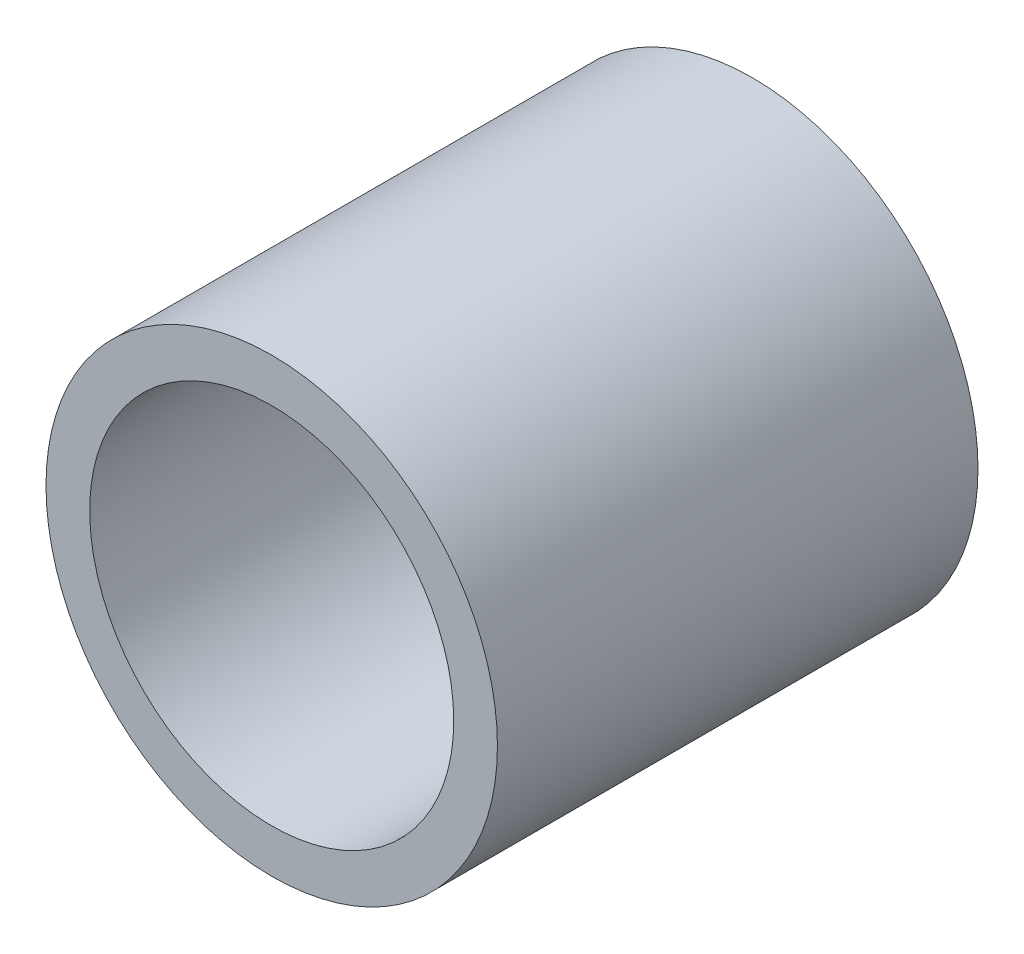
ISO-10303-21;
HEADER;
FILE_DESCRIPTION(('STEP AP214'),'2;1');
FILE_NAME('part.step','',(''),(''),'','','');
FILE_SCHEMA(('AUTOMOTIVE_DESIGN { 1 0 10303 214 1 1 1 1 }'));
ENDSEC;
DATA;
#1=APPLICATION_CONTEXT('core data for automotive mechanical design processes');
#2=APPLICATION_PROTOCOL_DEFINITION('international standard','automotive_design',2000,#1);
#3=PRODUCT_CONTEXT('',#1,'mechanical');
#4=PRODUCT('Part','Part','',(#3));
#5=PRODUCT_RELATED_PRODUCT_CATEGORY('part','',(#4));
#6=PRODUCT_DEFINITION_FORMATION('','',#4);
#7=PRODUCT_DEFINITION_CONTEXT('part definition',#1,'design');
#8=PRODUCT_DEFINITION('design','',#6,#7);
#9=PRODUCT_DEFINITION_SHAPE('','',#8);
#10=(LENGTH_UNIT() NAMED_UNIT(*) SI_UNIT(.MILLI.,.METRE.));
#11=(NAMED_UNIT(*) PLANE_ANGLE_UNIT() SI_UNIT($,.RADIAN.));
#12=(NAMED_UNIT(*) SI_UNIT($,.STERADIAN.) SOLID_ANGLE_UNIT());
#13=UNCERTAINTY_MEASURE_WITH_UNIT(LENGTH_MEASURE(1.E-05),#10,'distance_accuracy_value','');
#14=(GEOMETRIC_REPRESENTATION_CONTEXT(3) GLOBAL_UNCERTAINTY_ASSIGNED_CONTEXT((#13)) GLOBAL_UNIT_ASSIGNED_CONTEXT((#10,
#11,#12)) REPRESENTATION_CONTEXT('',''));
#15=CARTESIAN_POINT('',(0.,0.,0.));
#16=DIRECTION('',(0.,0.,1.));
#17=DIRECTION('',(1.,0.,0.));
#18=AXIS2_PLACEMENT_3D('',#15,#16,#17);
#19=CARTESIAN_POINT('',(0.,0.,33.));
#20=DIRECTION('',(0.,0.,1.));
#21=DIRECTION('',(1.,0.,0.));
#22=AXIS2_PLACEMENT_3D('',#19,#20,#21);
#23=PLANE('',#22);
#24=CARTESIAN_POINT('',(0.,0.,33.));
#25=DIRECTION('',(0.,0.,1.));
#26=DIRECTION('',(1.,0.,0.));
#27=AXIS2_PLACEMENT_3D('',#24,#25,#26);
#28=CIRCLE('',#27,15.5);
#29=CARTESIAN_POINT('',(15.5,0.,33.));
#30=VERTEX_POINT('',#29);
#31=EDGE_CURVE('E10',#30,#30,#28,.T.);
#32=ORIENTED_EDGE('',*,*,#31,.T.);
#33=EDGE_LOOP('',(#32));
#34=FACE_BOUND('',#33,.T.);
#35=CARTESIAN_POINT('',(0.,0.,33.));
#36=DIRECTION('',(0.,0.,1.));
#37=DIRECTION('',(1.,0.,0.));
#38=AXIS2_PLACEMENT_3D('',#35,#36,#37);
#39=CIRCLE('',#38,12.5);
#40=CARTESIAN_POINT('',(12.5,0.,33.));
#41=VERTEX_POINT('',#40);
#42=EDGE_CURVE('E42',#41,#41,#39,.T.);
#43=ORIENTED_EDGE('',*,*,#42,.F.);
#44=EDGE_LOOP('',(#43));
#45=FACE_BOUND('',#44,.T.);
#46=ADVANCED_FACE('F31',(#34,#45),#23,.T.);
#47=CARTESIAN_POINT('',(0.,0.,0.));
#48=DIRECTION('',(0.,0.,1.));
#49=DIRECTION('',(1.,0.,0.));
#50=AXIS2_PLACEMENT_3D('',#47,#48,#49);
#51=PLANE('',#50);
#52=CARTESIAN_POINT('',(0.,0.,0.));
#53=DIRECTION('',(0.,0.,1.));
#54=DIRECTION('',(1.,0.,0.));
#55=AXIS2_PLACEMENT_3D('',#52,#53,#54);
#56=CIRCLE('',#55,15.5);
#57=CARTESIAN_POINT('',(15.5,0.,0.));
#58=VERTEX_POINT('',#57);
#59=EDGE_CURVE('E35',#58,#58,#56,.T.);
#60=ORIENTED_EDGE('',*,*,#59,.F.);
#61=EDGE_LOOP('',(#60));
#62=FACE_BOUND('',#61,.T.);
#63=CARTESIAN_POINT('',(0.,0.,0.));
#64=DIRECTION('',(0.,0.,1.));
#65=DIRECTION('',(1.,0.,0.));
#66=AXIS2_PLACEMENT_3D('',#63,#64,#65);
#67=CIRCLE('',#66,12.5);
#68=CARTESIAN_POINT('',(12.5,0.,0.));
#69=VERTEX_POINT('',#68);
#70=EDGE_CURVE('E44',#69,#69,#67,.T.);
#71=ORIENTED_EDGE('',*,*,#70,.T.);
#72=EDGE_LOOP('',(#71));
#73=FACE_BOUND('',#72,.T.);
#74=ADVANCED_FACE('F54',(#62,#73),#51,.F.);
#75=CARTESIAN_POINT('',(0.,0.,33.));
#76=DIRECTION('',(0.,0.,-1.));
#77=DIRECTION('',(-1.,0.,0.));
#78=AXIS2_PLACEMENT_3D('',#75,#76,#77);
#79=CYLINDRICAL_SURFACE('',#78,15.5);
#80=ORIENTED_EDGE('',*,*,#31,.F.);
#81=EDGE_LOOP('',(#80));
#82=FACE_BOUND('',#81,.T.);
#83=ORIENTED_EDGE('',*,*,#59,.T.);
#84=EDGE_LOOP('',(#83));
#85=FACE_BOUND('',#84,.T.);
#86=ADVANCED_FACE('F33',(#82,#85),#79,.T.);
#87=CARTESIAN_POINT('',(0.,0.,33.));
#88=DIRECTION('',(0.,0.,-1.));
#89=DIRECTION('',(-1.,0.,0.));
#90=AXIS2_PLACEMENT_3D('',#87,#88,#89);
#91=CYLINDRICAL_SURFACE('',#90,12.5);
#92=ORIENTED_EDGE('',*,*,#42,.T.);
#93=EDGE_LOOP('',(#92));
#94=FACE_BOUND('',#93,.T.);
#95=ORIENTED_EDGE('',*,*,#70,.F.);
#96=EDGE_LOOP('',(#95));
#97=FACE_BOUND('',#96,.T.);
#98=ADVANCED_FACE('F50',(#94,#97),#91,.F.);
#99=CLOSED_SHELL('',(#46,#74,#86,#98));
#100=MANIFOLD_SOLID_BREP('B2',#99);
#101=ADVANCED_BREP_SHAPE_REPRESENTATION('',(#18,#100),#14);
#102=SHAPE_DEFINITION_REPRESENTATION(#9,#101);
ENDSEC;
END-ISO-10303-21;
